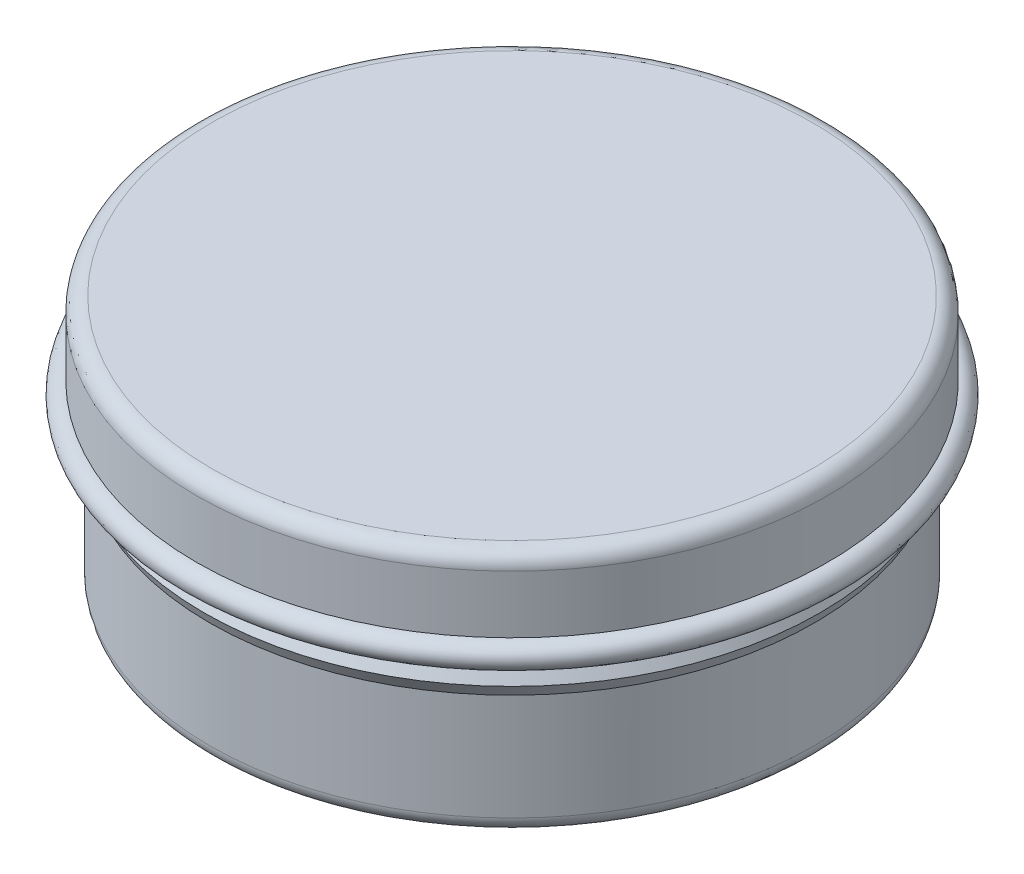
ISO-10303-21;
HEADER;
FILE_DESCRIPTION(('STEP AP214'),'2;1');
FILE_NAME('part.step','',(''),(''),'','','');
FILE_SCHEMA(('AUTOMOTIVE_DESIGN { 1 0 10303 214 1 1 1 1 }'));
ENDSEC;
DATA;
#1=APPLICATION_CONTEXT('core data for automotive mechanical design processes');
#2=APPLICATION_PROTOCOL_DEFINITION('international standard','automotive_design',2000,#1);
#3=PRODUCT_CONTEXT('',#1,'mechanical');
#4=PRODUCT('Part','Part','',(#3));
#5=PRODUCT_RELATED_PRODUCT_CATEGORY('part','',(#4));
#6=PRODUCT_DEFINITION_FORMATION('','',#4);
#7=PRODUCT_DEFINITION_CONTEXT('part definition',#1,'design');
#8=PRODUCT_DEFINITION('design','',#6,#7);
#9=PRODUCT_DEFINITION_SHAPE('','',#8);
#10=(LENGTH_UNIT() NAMED_UNIT(*) SI_UNIT(.MILLI.,.METRE.));
#11=(NAMED_UNIT(*) PLANE_ANGLE_UNIT() SI_UNIT($,.RADIAN.));
#12=(NAMED_UNIT(*) SI_UNIT($,.STERADIAN.) SOLID_ANGLE_UNIT());
#13=UNCERTAINTY_MEASURE_WITH_UNIT(LENGTH_MEASURE(1.E-05),#10,'distance_accuracy_value','');
#14=(GEOMETRIC_REPRESENTATION_CONTEXT(3) GLOBAL_UNCERTAINTY_ASSIGNED_CONTEXT((#13)) GLOBAL_UNIT_ASSIGNED_CONTEXT((#10,
#11,#12)) REPRESENTATION_CONTEXT('',''));
#15=CARTESIAN_POINT('',(0.,0.,0.));
#16=DIRECTION('',(0.,0.,1.));
#17=DIRECTION('',(1.,0.,0.));
#18=AXIS2_PLACEMENT_3D('',#15,#16,#17);
#19=CARTESIAN_POINT('',(-21.315,17.1675,0.));
#20=DIRECTION('',(0.,1.,0.));
#21=DIRECTION('',(0.,0.,1.));
#22=AXIS2_PLACEMENT_3D('',#19,#20,#21);
#23=PLANE('',#22);
#24=CARTESIAN_POINT('',(0.,17.1675,0.));
#25=DIRECTION('',(0.,1.,0.));
#26=DIRECTION('',(0.,0.,1.));
#27=AXIS2_PLACEMENT_3D('',#24,#25,#26);
#28=CIRCLE('',#27,20.265);
#29=CARTESIAN_POINT('',(0.,17.1675,20.265));
#30=VERTEX_POINT('',#29);
#31=EDGE_CURVE('E50',#30,#30,#28,.T.);
#32=ORIENTED_EDGE('',*,*,#31,.T.);
#33=EDGE_LOOP('',(#32));
#34=FACE_BOUND('',#33,.T.);
#35=ADVANCED_FACE('F35',(#34),#23,.T.);
#36=CARTESIAN_POINT('',(0.,25.7484715423179,0.));
#37=DIRECTION('',(0.,1.,0.));
#38=DIRECTION('',(0.,0.,1.));
#39=AXIS2_PLACEMENT_3D('',#36,#37,#38);
#40=CYLINDRICAL_SURFACE('',#39,21.315);
#41=CARTESIAN_POINT('',(0.,16.1175,0.));
#42=DIRECTION('',(0.,1.,0.));
#43=DIRECTION('',(0.,0.,1.));
#44=AXIS2_PLACEMENT_3D('',#41,#42,#43);
#45=CIRCLE('',#44,21.315);
#46=CARTESIAN_POINT('',(0.,16.1175,21.315));
#47=VERTEX_POINT('',#46);
#48=EDGE_CURVE('E46',#47,#47,#45,.F.);
#49=ORIENTED_EDGE('',*,*,#48,.T.);
#50=EDGE_LOOP('',(#49));
#51=FACE_BOUND('',#50,.T.);
#52=CARTESIAN_POINT('',(0.,12.222,0.));
#53=DIRECTION('',(0.,1.,0.));
#54=DIRECTION('',(0.,0.,1.));
#55=AXIS2_PLACEMENT_3D('',#52,#53,#54);
#56=CIRCLE('',#55,21.315);
#57=CARTESIAN_POINT('',(0.,12.222,21.315));
#58=VERTEX_POINT('',#57);
#59=EDGE_CURVE('E55',#58,#58,#56,.T.);
#60=ORIENTED_EDGE('',*,*,#59,.T.);
#61=EDGE_LOOP('',(#60));
#62=FACE_BOUND('',#61,.T.);
#63=ADVANCED_FACE('F80',(#51,#62),#40,.T.);
#64=CARTESIAN_POINT('',(-21.315,11.382,0.));
#65=DIRECTION('',(0.,0.,1.));
#66=DIRECTION('',(-1.,0.,0.));
#67=AXIS2_PLACEMENT_3D('',#64,#65,#66);
#68=ELLIPSE('',#67,0.944999999999998,0.840000000000001);
#69=CARTESIAN_POINT('',(0.,25.7484715423179,0.));
#70=DIRECTION('',(0.,1.,0.));
#71=AXIS1_PLACEMENT('',#69,#70);
#72=SURFACE_OF_REVOLUTION('',#68,#71);
#73=CARTESIAN_POINT('',(0.,10.542,0.));
#74=DIRECTION('',(0.,1.,0.));
#75=DIRECTION('',(0.,0.,1.));
#76=AXIS2_PLACEMENT_3D('',#73,#74,#75);
#77=CIRCLE('',#76,21.315);
#78=CARTESIAN_POINT('',(0.,10.542,21.315));
#79=VERTEX_POINT('',#78);
#80=EDGE_CURVE('E58',#79,#79,#77,.T.);
#81=ORIENTED_EDGE('',*,*,#80,.T.);
#82=EDGE_LOOP('',(#81));
#83=FACE_BOUND('',#82,.T.);
#84=ORIENTED_EDGE('',*,*,#59,.F.);
#85=EDGE_LOOP('',(#84));
#86=FACE_BOUND('',#85,.T.);
#87=ADVANCED_FACE('F75',(#83,#86),#72,.F.);
#88=CARTESIAN_POINT('',(-20.4225,10.542,0.));
#89=DIRECTION('',(0.,-1.,0.));
#90=DIRECTION('',(0.,0.,-1.));
#91=AXIS2_PLACEMENT_3D('',#88,#89,#90);
#92=PLANE('',#91);
#93=CARTESIAN_POINT('',(0.,10.542,0.));
#94=DIRECTION('',(0.,1.,0.));
#95=DIRECTION('',(0.,0.,1.));
#96=AXIS2_PLACEMENT_3D('',#93,#94,#95);
#97=CIRCLE('',#96,20.4225);
#98=CARTESIAN_POINT('',(0.,10.542,20.4225));
#99=VERTEX_POINT('',#98);
#100=EDGE_CURVE('E61',#99,#99,#97,.T.);
#101=ORIENTED_EDGE('',*,*,#100,.T.);
#102=EDGE_LOOP('',(#101));
#103=FACE_BOUND('',#102,.T.);
#104=ORIENTED_EDGE('',*,*,#80,.F.);
#105=EDGE_LOOP('',(#104));
#106=FACE_BOUND('',#105,.T.);
#107=ADVANCED_FACE('F79',(#103,#106),#92,.T.);
#108=CARTESIAN_POINT('',(0.,25.7484715423179,0.));
#109=DIRECTION('',(0.,1.,0.));
#110=DIRECTION('',(0.,0.,1.));
#111=AXIS2_PLACEMENT_3D('',#108,#109,#110);
#112=CYLINDRICAL_SURFACE('',#111,20.4225);
#113=CARTESIAN_POINT('',(0.,9.82283761589201,0.));
#114=DIRECTION('',(0.,1.,0.));
#115=DIRECTION('',(0.,0.,1.));
#116=AXIS2_PLACEMENT_3D('',#113,#114,#115);
#117=CIRCLE('',#116,20.4225);
#118=CARTESIAN_POINT('',(0.,9.82283761589201,20.4225));
#119=VERTEX_POINT('',#118);
#120=EDGE_CURVE('E64',#119,#119,#117,.T.);
#121=ORIENTED_EDGE('',*,*,#120,.T.);
#122=EDGE_LOOP('',(#121));
#123=FACE_BOUND('',#122,.T.);
#124=ORIENTED_EDGE('',*,*,#100,.F.);
#125=EDGE_LOOP('',(#124));
#126=FACE_BOUND('',#125,.T.);
#127=ADVANCED_FACE('F116',(#123,#126),#112,.T.);
#128=CARTESIAN_POINT('',(0.,9.82283761589201,0.));
#129=DIRECTION('',(0.,-1.,0.));
#130=DIRECTION('',(0.,0.,-1.));
#131=AXIS2_PLACEMENT_3D('',#128,#129,#130);
#132=CONICAL_SURFACE('',#131,20.4225,0.459657477319518);
#133=CARTESIAN_POINT('',(0.,9.02741880794598,0.));
#134=DIRECTION('',(0.,1.,0.));
#135=DIRECTION('',(0.,0.,1.));
#136=AXIS2_PLACEMENT_3D('',#133,#134,#135);
#137=CIRCLE('',#136,20.81625);
#138=CARTESIAN_POINT('',(0.,9.02741880794598,20.81625));
#139=VERTEX_POINT('',#138);
#140=EDGE_CURVE('E67',#139,#139,#137,.T.);
#141=ORIENTED_EDGE('',*,*,#140,.T.);
#142=EDGE_LOOP('',(#141));
#143=FACE_BOUND('',#142,.T.);
#144=ORIENTED_EDGE('',*,*,#120,.F.);
#145=EDGE_LOOP('',(#144));
#146=FACE_BOUND('',#145,.T.);
#147=ADVANCED_FACE('F113',(#143,#146),#132,.T.);
#148=CARTESIAN_POINT('',(0.,9.02741880794598,0.));
#149=DIRECTION('',(0.,1.,0.));
#150=DIRECTION('',(0.,0.,1.));
#151=AXIS2_PLACEMENT_3D('',#148,#149,#150);
#152=CONICAL_SURFACE('',#151,20.81625,0.459657477319522);
#153=CARTESIAN_POINT('',(0.,8.23199999999996,0.));
#154=DIRECTION('',(0.,1.,0.));
#155=DIRECTION('',(0.,0.,1.));
#156=AXIS2_PLACEMENT_3D('',#153,#154,#155);
#157=CIRCLE('',#156,20.4225);
#158=CARTESIAN_POINT('',(0.,8.23199999999996,20.4225));
#159=VERTEX_POINT('',#158);
#160=EDGE_CURVE('E70',#159,#159,#157,.T.);
#161=ORIENTED_EDGE('',*,*,#160,.T.);
#162=EDGE_LOOP('',(#161));
#163=FACE_BOUND('',#162,.T.);
#164=ORIENTED_EDGE('',*,*,#140,.F.);
#165=EDGE_LOOP('',(#164));
#166=FACE_BOUND('',#165,.T.);
#167=ADVANCED_FACE('F108',(#163,#166),#152,.T.);
#168=CARTESIAN_POINT('',(0.,25.7484715423179,0.));
#169=DIRECTION('',(0.,1.,0.));
#170=DIRECTION('',(0.,0.,1.));
#171=AXIS2_PLACEMENT_3D('',#168,#169,#170);
#172=CYLINDRICAL_SURFACE('',#171,20.4225);
#173=CARTESIAN_POINT('',(0.,1.05,0.));
#174=DIRECTION('',(0.,-1.,0.));
#175=DIRECTION('',(0.,0.,-1.));
#176=AXIS2_PLACEMENT_3D('',#173,#174,#175);
#177=CIRCLE('',#176,20.4225);
#178=CARTESIAN_POINT('',(0.,1.05,-20.4225));
#179=VERTEX_POINT('',#178);
#180=EDGE_CURVE('E42',#179,#179,#177,.F.);
#181=ORIENTED_EDGE('',*,*,#180,.T.);
#182=EDGE_LOOP('',(#181));
#183=FACE_BOUND('',#182,.T.);
#184=ORIENTED_EDGE('',*,*,#160,.F.);
#185=EDGE_LOOP('',(#184));
#186=FACE_BOUND('',#185,.T.);
#187=ADVANCED_FACE('F97',(#183,#186),#172,.T.);
#188=CARTESIAN_POINT('',(0.,0.,0.));
#189=DIRECTION('',(0.,-1.,0.));
#190=DIRECTION('',(0.,0.,-1.));
#191=AXIS2_PLACEMENT_3D('',#188,#189,#190);
#192=PLANE('',#191);
#193=CARTESIAN_POINT('',(0.,0.,0.));
#194=DIRECTION('',(0.,-1.,0.));
#195=DIRECTION('',(0.,0.,-1.));
#196=AXIS2_PLACEMENT_3D('',#193,#194,#195);
#197=CIRCLE('',#196,19.3725);
#198=CARTESIAN_POINT('',(0.,0.,-19.3725));
#199=VERTEX_POINT('',#198);
#200=EDGE_CURVE('E10',#199,#199,#197,.T.);
#201=ORIENTED_EDGE('',*,*,#200,.T.);
#202=EDGE_LOOP('',(#201));
#203=FACE_BOUND('',#202,.T.);
#204=ADVANCED_FACE('F90',(#203),#192,.T.);
#205=CARTESIAN_POINT('',(0.,16.1175,0.));
#206=DIRECTION('',(0.,1.,0.));
#207=DIRECTION('',(0.,0.,1.));
#208=AXIS2_PLACEMENT_3D('',#205,#206,#207);
#209=TOROIDAL_SURFACE('',#208,20.265,1.05);
#210=ORIENTED_EDGE('',*,*,#48,.F.);
#211=EDGE_LOOP('',(#210));
#212=FACE_BOUND('',#211,.T.);
#213=ORIENTED_EDGE('',*,*,#31,.F.);
#214=EDGE_LOOP('',(#213));
#215=FACE_BOUND('',#214,.T.);
#216=ADVANCED_FACE('F88',(#212,#215),#209,.T.);
#217=CARTESIAN_POINT('',(0.,1.05,0.));
#218=DIRECTION('',(0.,-1.,0.));
#219=DIRECTION('',(0.,0.,-1.));
#220=AXIS2_PLACEMENT_3D('',#217,#218,#219);
#221=TOROIDAL_SURFACE('',#220,19.3725,1.05);
#222=ORIENTED_EDGE('',*,*,#200,.F.);
#223=EDGE_LOOP('',(#222));
#224=FACE_BOUND('',#223,.T.);
#225=ORIENTED_EDGE('',*,*,#180,.F.);
#226=EDGE_LOOP('',(#225));
#227=FACE_BOUND('',#226,.T.);
#228=ADVANCED_FACE('F37',(#224,#227),#221,.T.);
#229=CLOSED_SHELL('',(#35,#63,#87,#107,#127,#147,#167,#187,#204,#216,#228));
#230=MANIFOLD_SOLID_BREP('B2',#229);
#231=ADVANCED_BREP_SHAPE_REPRESENTATION('',(#18,#230),#14);
#232=SHAPE_DEFINITION_REPRESENTATION(#9,#231);
ENDSEC;
END-ISO-10303-21;
